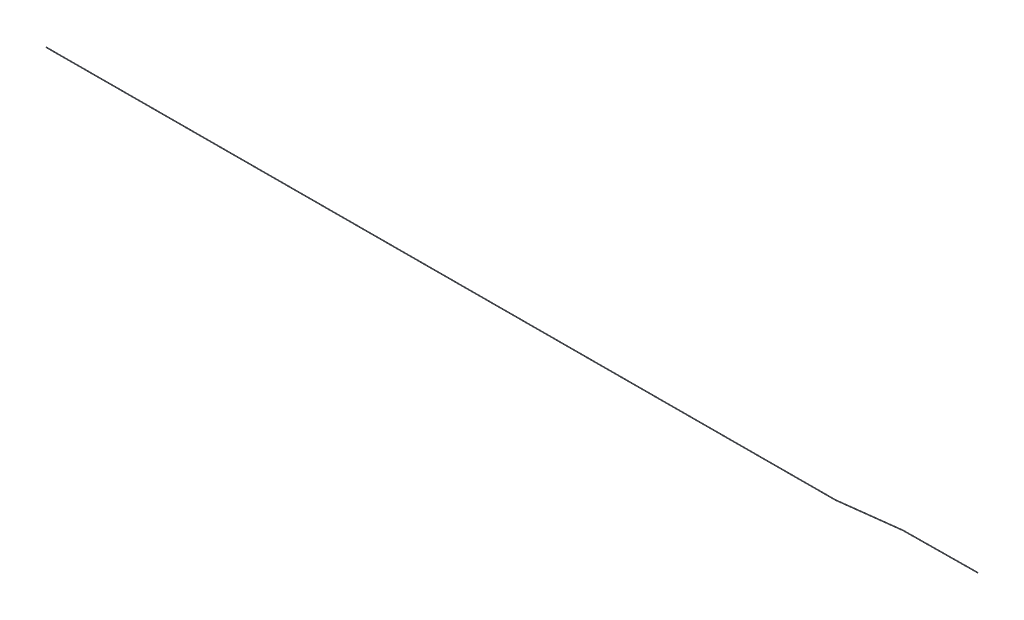
ISO-10303-21;
HEADER;
FILE_DESCRIPTION(('STEP AP214'),'2;1');
FILE_NAME('part.step','',(''),(''),'','','');
FILE_SCHEMA(('AUTOMOTIVE_DESIGN { 1 0 10303 214 1 1 1 1 }'));
ENDSEC;
DATA;
#1=APPLICATION_CONTEXT('core data for automotive mechanical design processes');
#2=APPLICATION_PROTOCOL_DEFINITION('international standard','automotive_design',2000,#1);
#3=PRODUCT_CONTEXT('',#1,'mechanical');
#4=PRODUCT('Part','Part','',(#3));
#5=PRODUCT_RELATED_PRODUCT_CATEGORY('part','',(#4));
#6=PRODUCT_DEFINITION_FORMATION('','',#4);
#7=PRODUCT_DEFINITION_CONTEXT('part definition',#1,'design');
#8=PRODUCT_DEFINITION('design','',#6,#7);
#9=PRODUCT_DEFINITION_SHAPE('','',#8);
#10=(LENGTH_UNIT() NAMED_UNIT(*) SI_UNIT(.MILLI.,.METRE.));
#11=(NAMED_UNIT(*) PLANE_ANGLE_UNIT() SI_UNIT($,.RADIAN.));
#12=(NAMED_UNIT(*) SI_UNIT($,.STERADIAN.) SOLID_ANGLE_UNIT());
#13=UNCERTAINTY_MEASURE_WITH_UNIT(LENGTH_MEASURE(1.E-05),#10,'distance_accuracy_value','');
#14=(GEOMETRIC_REPRESENTATION_CONTEXT(3) GLOBAL_UNCERTAINTY_ASSIGNED_CONTEXT((#13)) GLOBAL_UNIT_ASSIGNED_CONTEXT((#10,
#11,#12)) REPRESENTATION_CONTEXT('',''));
#15=CARTESIAN_POINT('',(0.,0.,0.));
#16=DIRECTION('',(0.,0.,1.));
#17=DIRECTION('',(1.,0.,0.));
#18=AXIS2_PLACEMENT_3D('',#15,#16,#17);
#19=CARTESIAN_POINT('',(389.062465523597,1.16440957310937,-3.3634840662346));
#20=DIRECTION('',(-0.999976414684668,-0.00495627280485886,0.00475451724998695));
#21=DIRECTION('',(0.00495632882515822,-0.999987717326856,0.));
#22=AXIS2_PLACEMENT_3D('',#19,#20,#21);
#23=PLANE('',#22);
#24=CARTESIAN_POINT('',(389.062465523597,1.16440957310937,-3.3634840662346));
#25=DIRECTION('',(-0.999976414684668,-0.00495627280485886,0.00475451724998695));
#26=DIRECTION('',(0.00495632882515822,-0.999987717326856,0.));
#27=AXIS2_PLACEMENT_3D('',#24,#25,#26);
#28=CIRCLE('',#27,0.225);
#29=CARTESIAN_POINT('',(389.063580697583,0.939412336710828,-3.3634840662346));
#30=VERTEX_POINT('',#29);
#31=EDGE_CURVE('E39',#30,#30,#28,.T.);
#32=ORIENTED_EDGE('',*,*,#31,.F.);
#33=EDGE_LOOP('',(#32));
#34=FACE_BOUND('',#33,.T.);
#35=ADVANCED_FACE('F36',(#34),#23,.F.);
#36=CARTESIAN_POINT('',(-389.062465523597,-1.16440957310943,3.3634840662346));
#37=DIRECTION('',(-0.999995518956924,-0.00297853476155595,0.000300660517992055));
#38=DIRECTION('',(0.00297857429162314,-0.999995555442096,0.000131115378780535));
#39=AXIS2_PLACEMENT_3D('',#36,#37,#38);
#40=PLANE('',#39);
#41=CARTESIAN_POINT('',(-389.062465523597,-1.16440957310943,3.3634840662346));
#42=DIRECTION('',(-0.999995518956924,-0.00297853476155595,0.000300660517992055));
#43=DIRECTION('',(0.00297857429162314,-0.999995555442096,0.000131115378780535));
#44=AXIS2_PLACEMENT_3D('',#41,#42,#43);
#45=CIRCLE('',#44,0.225);
#46=CARTESIAN_POINT('',(-389.061795344382,-1.3894085730839,3.36351356719483));
#47=VERTEX_POINT('',#46);
#48=EDGE_CURVE('E43',#47,#47,#45,.T.);
#49=ORIENTED_EDGE('',*,*,#48,.T.);
#50=EDGE_LOOP('',(#49));
#51=FACE_BOUND('',#50,.T.);
#52=ADVANCED_FACE('F59',(#51),#40,.T.);
#53=CARTESIAN_POINT('',(326.154621205184,0.852613781299655,-3.06438058081319));
#54=DIRECTION('',(0.999976414684668,0.00495627280485887,-0.00475451724998695));
#55=DIRECTION('',(-0.00495632882515823,0.999987717326856,0.));
#56=AXIS2_PLACEMENT_3D('',#53,#54,#55);
#57=CYLINDRICAL_SURFACE('',#56,0.225);
#58=CARTESIAN_POINT('',(326.354616488121,0.853605035860627,-3.0653314842632));
#59=DIRECTION('',(0.997966544593536,0.00285223871666429,-0.0636760599153281));
#60=DIRECTION('',(-0.0635337749436815,-0.0357653116215306,-0.997338609463216));
#61=AXIS2_PLACEMENT_3D('',#58,#59,#60);
#62=ELLIPSE('',#61,0.22539220663848,0.225);
#63=CARTESIAN_POINT('',(326.340296470391,0.845543813353137,-3.29012383421587));
#64=VERTEX_POINT('',#63);
#65=EDGE_CURVE('E48',#64,#64,#62,.T.);
#66=ORIENTED_EDGE('',*,*,#65,.T.);
#67=EDGE_LOOP('',(#66));
#68=FACE_BOUND('',#67,.T.);
#69=ORIENTED_EDGE('',*,*,#31,.T.);
#70=EDGE_LOOP('',(#69));
#71=FACE_BOUND('',#70,.T.);
#72=ADVANCED_FACE('F56',(#68,#71),#57,.T.);
#73=CARTESIAN_POINT('',(275.638973062668,0.815879215894809,3.1880492107146));
#74=DIRECTION('',(0.992483536636566,0.000738278225282218,-0.122375996219176));
#75=DIRECTION('',(-0.122376029569998,0.,-0.992483807115604));
#76=AXIS2_PLACEMENT_3D('',#73,#74,#75);
#77=CYLINDRICAL_SURFACE('',#76,0.225);
#78=CARTESIAN_POINT('',(275.837469769995,0.816026871539865,3.16357401147077));
#79=DIRECTION('',(0.99810821809524,0.00186189238821448,-0.0614533833688628));
#80=DIRECTION('',(0.0614091497216804,0.0183137077783299,0.997944649987097));
#81=AXIS2_PLACEMENT_3D('',#78,#79,#80);
#82=ELLIPSE('',#81,0.22542204239586,0.225);
#83=CARTESIAN_POINT('',(275.851312745947,0.820155184951097,3.38853273266888));
#84=VERTEX_POINT('',#83);
#85=EDGE_CURVE('E11',#84,#84,#82,.T.);
#86=ORIENTED_EDGE('',*,*,#85,.T.);
#87=EDGE_LOOP('',(#86));
#88=FACE_BOUND('',#87,.T.);
#89=ORIENTED_EDGE('',*,*,#65,.F.);
#90=EDGE_LOOP('',(#89));
#91=FACE_BOUND('',#90,.T.);
#92=ADVANCED_FACE('F66',(#88,#91),#77,.T.);
#93=CARTESIAN_POINT('',(-389.062465523597,-1.16440957310943,3.3634840662346));
#94=DIRECTION('',(0.999995518956924,0.00297853476155596,-0.000300660517992067));
#95=DIRECTION('',(-0.00297853489618089,0.999995564155098,0.));
#96=AXIS2_PLACEMENT_3D('',#93,#94,#95);
#97=CYLINDRICAL_SURFACE('',#96,0.225);
#98=ORIENTED_EDGE('',*,*,#48,.F.);
#99=EDGE_LOOP('',(#98));
#100=FACE_BOUND('',#99,.T.);
#101=ORIENTED_EDGE('',*,*,#85,.F.);
#102=EDGE_LOOP('',(#101));
#103=FACE_BOUND('',#102,.T.);
#104=ADVANCED_FACE('F64',(#100,#103),#97,.T.);
#105=CLOSED_SHELL('',(#35,#52,#72,#92,#104));
#106=MANIFOLD_SOLID_BREP('B2',#105);
#107=ADVANCED_BREP_SHAPE_REPRESENTATION('',(#18,#106),#14);
#108=SHAPE_DEFINITION_REPRESENTATION(#9,#107);
ENDSEC;
END-ISO-10303-21;
